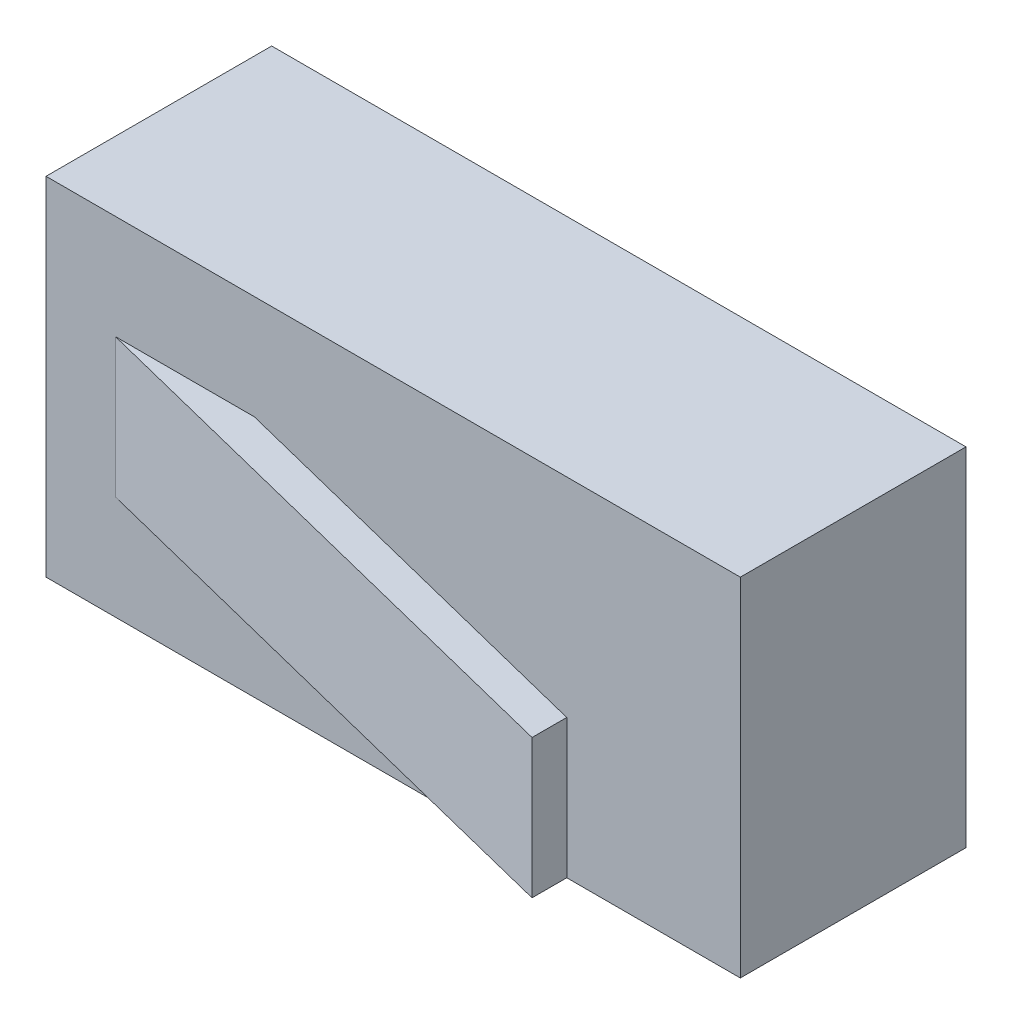
ISO-10303-21;
HEADER;
FILE_DESCRIPTION(('STEP AP214'),'2;1');
FILE_NAME('part.step','',(''),(''),'','','');
FILE_SCHEMA(('AUTOMOTIVE_DESIGN { 1 0 10303 214 1 1 1 1 }'));
ENDSEC;
DATA;
#1=APPLICATION_CONTEXT('core data for automotive mechanical design processes');
#2=APPLICATION_PROTOCOL_DEFINITION('international standard','automotive_design',2000,#1);
#3=PRODUCT_CONTEXT('',#1,'mechanical');
#4=PRODUCT('Part','Part','',(#3));
#5=PRODUCT_RELATED_PRODUCT_CATEGORY('part','',(#4));
#6=PRODUCT_DEFINITION_FORMATION('','',#4);
#7=PRODUCT_DEFINITION_CONTEXT('part definition',#1,'design');
#8=PRODUCT_DEFINITION('design','',#6,#7);
#9=PRODUCT_DEFINITION_SHAPE('','',#8);
#10=(LENGTH_UNIT() NAMED_UNIT(*) SI_UNIT(.MILLI.,.METRE.));
#11=(NAMED_UNIT(*) PLANE_ANGLE_UNIT() SI_UNIT($,.RADIAN.));
#12=(NAMED_UNIT(*) SI_UNIT($,.STERADIAN.) SOLID_ANGLE_UNIT());
#13=UNCERTAINTY_MEASURE_WITH_UNIT(LENGTH_MEASURE(1.E-05),#10,'distance_accuracy_value','');
#14=(GEOMETRIC_REPRESENTATION_CONTEXT(3) GLOBAL_UNCERTAINTY_ASSIGNED_CONTEXT((#13)) GLOBAL_UNIT_ASSIGNED_CONTEXT((#10,
#11,#12)) REPRESENTATION_CONTEXT('',''));
#15=CARTESIAN_POINT('',(0.,0.,0.));
#16=DIRECTION('',(0.,0.,1.));
#17=DIRECTION('',(1.,0.,0.));
#18=AXIS2_PLACEMENT_3D('',#15,#16,#17);
#19=CARTESIAN_POINT('',(-10.,9.,-215.));
#20=DIRECTION('',(-1.,0.,0.));
#21=DIRECTION('',(0.,0.,1.));
#22=AXIS2_PLACEMENT_3D('',#19,#20,#21);
#23=PLANE('',#22);
#24=DIRECTION('',(0.,-1.,0.));
#25=VECTOR('',#24,1.);
#26=CARTESIAN_POINT('',(-10.,9.,-208.5));
#27=LINE('',#26,#25);
#28=CARTESIAN_POINT('',(-10.,19.,-208.5));
#29=VERTEX_POINT('',#28);
#30=CARTESIAN_POINT('',(-10.,9.,-208.5));
#31=VERTEX_POINT('',#30);
#32=EDGE_CURVE('E131',#29,#31,#27,.T.);
#33=ORIENTED_EDGE('',*,*,#32,.F.);
#34=DIRECTION('',(0.,0.,1.));
#35=VECTOR('',#34,1.);
#36=CARTESIAN_POINT('',(-10.,19.,-215.));
#37=LINE('',#36,#35);
#38=CARTESIAN_POINT('',(-10.,19.,-215.));
#39=VERTEX_POINT('',#38);
#40=EDGE_CURVE('E156',#39,#29,#37,.T.);
#41=ORIENTED_EDGE('',*,*,#40,.F.);
#42=DIRECTION('',(0.,-1.,0.));
#43=VECTOR('',#42,1.);
#44=CARTESIAN_POINT('',(-10.,9.,-215.));
#45=LINE('',#44,#43);
#46=CARTESIAN_POINT('',(-10.,9.,-215.));
#47=VERTEX_POINT('',#46);
#48=EDGE_CURVE('E132',#39,#47,#45,.T.);
#49=ORIENTED_EDGE('',*,*,#48,.T.);
#50=DIRECTION('',(0.,0.,1.));
#51=VECTOR('',#50,1.);
#52=CARTESIAN_POINT('',(-10.,9.,-215.));
#53=LINE('',#52,#51);
#54=EDGE_CURVE('E145',#47,#31,#53,.T.);
#55=ORIENTED_EDGE('',*,*,#54,.T.);
#56=EDGE_LOOP('',(#33,#41,#49,#55));
#57=FACE_BOUND('',#56,.T.);
#58=ADVANCED_FACE('F39',(#57),#23,.T.);
#59=CARTESIAN_POINT('',(-10.,19.,-215.));
#60=DIRECTION('',(0.,1.,0.));
#61=DIRECTION('',(0.,0.,1.));
#62=AXIS2_PLACEMENT_3D('',#59,#60,#61);
#63=PLANE('',#62);
#64=DIRECTION('',(-1.,0.,0.));
#65=VECTOR('',#64,1.);
#66=CARTESIAN_POINT('',(-10.,19.,-208.5));
#67=LINE('',#66,#65);
#68=CARTESIAN_POINT('',(10.,19.,-208.5));
#69=VERTEX_POINT('',#68);
#70=EDGE_CURVE('E136',#69,#29,#67,.T.);
#71=ORIENTED_EDGE('',*,*,#70,.F.);
#72=DIRECTION('',(0.,0.,1.));
#73=VECTOR('',#72,1.);
#74=CARTESIAN_POINT('',(10.,19.,-215.));
#75=LINE('',#74,#73);
#76=CARTESIAN_POINT('',(10.,19.,-215.));
#77=VERTEX_POINT('',#76);
#78=EDGE_CURVE('E159',#77,#69,#75,.T.);
#79=ORIENTED_EDGE('',*,*,#78,.F.);
#80=DIRECTION('',(-1.,0.,0.));
#81=VECTOR('',#80,1.);
#82=CARTESIAN_POINT('',(-10.,19.,-215.));
#83=LINE('',#82,#81);
#84=EDGE_CURVE('E142',#77,#39,#83,.T.);
#85=ORIENTED_EDGE('',*,*,#84,.T.);
#86=ORIENTED_EDGE('',*,*,#40,.T.);
#87=EDGE_LOOP('',(#71,#79,#85,#86));
#88=FACE_BOUND('',#87,.T.);
#89=ADVANCED_FACE('F182',(#88),#63,.T.);
#90=CARTESIAN_POINT('',(10.,9.,-215.));
#91=DIRECTION('',(1.,0.,0.));
#92=DIRECTION('',(0.,0.,-1.));
#93=AXIS2_PLACEMENT_3D('',#90,#91,#92);
#94=PLANE('',#93);
#95=DIRECTION('',(0.,1.,0.));
#96=VECTOR('',#95,1.);
#97=CARTESIAN_POINT('',(10.,9.,-208.5));
#98=LINE('',#97,#96);
#99=CARTESIAN_POINT('',(10.,9.,-208.5));
#100=VERTEX_POINT('',#99);
#101=EDGE_CURVE('E151',#100,#69,#98,.T.);
#102=ORIENTED_EDGE('',*,*,#101,.F.);
#103=DIRECTION('',(0.,0.,1.));
#104=VECTOR('',#103,1.);
#105=CARTESIAN_POINT('',(10.,9.,-215.));
#106=LINE('',#105,#104);
#107=CARTESIAN_POINT('',(10.,9.,-215.));
#108=VERTEX_POINT('',#107);
#109=EDGE_CURVE('E161',#108,#100,#106,.T.);
#110=ORIENTED_EDGE('',*,*,#109,.F.);
#111=DIRECTION('',(0.,1.,0.));
#112=VECTOR('',#111,1.);
#113=CARTESIAN_POINT('',(10.,9.,-215.));
#114=LINE('',#113,#112);
#115=EDGE_CURVE('E139',#108,#77,#114,.T.);
#116=ORIENTED_EDGE('',*,*,#115,.T.);
#117=ORIENTED_EDGE('',*,*,#78,.T.);
#118=EDGE_LOOP('',(#102,#110,#116,#117));
#119=FACE_BOUND('',#118,.T.);
#120=ADVANCED_FACE('F187',(#119),#94,.T.);
#121=CARTESIAN_POINT('',(-10.,9.,-215.));
#122=DIRECTION('',(0.,-1.,0.));
#123=DIRECTION('',(0.,0.,-1.));
#124=AXIS2_PLACEMENT_3D('',#121,#122,#123);
#125=PLANE('',#124);
#126=DIRECTION('',(1.,0.,0.));
#127=VECTOR('',#126,1.);
#128=CARTESIAN_POINT('',(-10.,9.,-208.5));
#129=LINE('',#128,#127);
#130=EDGE_CURVE('E148',#31,#100,#129,.T.);
#131=ORIENTED_EDGE('',*,*,#130,.F.);
#132=ORIENTED_EDGE('',*,*,#54,.F.);
#133=DIRECTION('',(1.,0.,0.));
#134=VECTOR('',#133,1.);
#135=CARTESIAN_POINT('',(-10.,9.,-215.));
#136=LINE('',#135,#134);
#137=EDGE_CURVE('E135',#47,#108,#136,.T.);
#138=ORIENTED_EDGE('',*,*,#137,.T.);
#139=ORIENTED_EDGE('',*,*,#109,.T.);
#140=EDGE_LOOP('',(#131,#132,#138,#139));
#141=FACE_BOUND('',#140,.T.);
#142=ADVANCED_FACE('F201',(#141),#125,.T.);
#143=CARTESIAN_POINT('',(0.,0.,-215.));
#144=DIRECTION('',(0.,0.,-1.));
#145=DIRECTION('',(-1.,0.,0.));
#146=AXIS2_PLACEMENT_3D('',#143,#144,#145);
#147=PLANE('',#146);
#148=ORIENTED_EDGE('',*,*,#48,.F.);
#149=ORIENTED_EDGE('',*,*,#84,.F.);
#150=ORIENTED_EDGE('',*,*,#115,.F.);
#151=ORIENTED_EDGE('',*,*,#137,.F.);
#152=EDGE_LOOP('',(#148,#149,#150,#151));
#153=FACE_BOUND('',#152,.T.);
#154=ADVANCED_FACE('F198',(#153),#147,.T.);
#155=CARTESIAN_POINT('',(0.,0.,-208.5));
#156=DIRECTION('',(0.,0.,-1.));
#157=DIRECTION('',(-1.,0.,0.));
#158=AXIS2_PLACEMENT_3D('',#155,#156,#157);
#159=PLANE('',#158);
#160=DIRECTION('',(0.,-1.,0.));
#161=VECTOR('',#160,1.);
#162=CARTESIAN_POINT('',(-8.,16.,-208.5));
#163=LINE('',#162,#161);
#164=CARTESIAN_POINT('',(-8.,16.,-208.5));
#165=VERTEX_POINT('',#164);
#166=CARTESIAN_POINT('',(-8.,12.,-208.5));
#167=VERTEX_POINT('',#166);
#168=EDGE_CURVE('E52',#165,#167,#163,.T.);
#169=ORIENTED_EDGE('',*,*,#168,.F.);
#170=DIRECTION('',(1.,0.,0.));
#171=VECTOR('',#170,1.);
#172=CARTESIAN_POINT('',(0.,16.,-208.5));
#173=LINE('',#172,#171);
#174=CARTESIAN_POINT('',(-4.,16.,-208.5));
#175=VERTEX_POINT('',#174);
#176=EDGE_CURVE('E11',#165,#175,#173,.T.);
#177=ORIENTED_EDGE('',*,*,#176,.T.);
#178=DIRECTION('',(0.,1.,0.));
#179=VECTOR('',#178,1.);
#180=CARTESIAN_POINT('',(-4.,0.,-208.5));
#181=LINE('',#180,#179);
#182=CARTESIAN_POINT('',(-3.99999999999999,12.,-208.5));
#183=VERTEX_POINT('',#182);
#184=EDGE_CURVE('E46',#183,#175,#181,.T.);
#185=ORIENTED_EDGE('',*,*,#184,.F.);
#186=DIRECTION('',(1.,0.,0.));
#187=VECTOR('',#186,1.);
#188=CARTESIAN_POINT('',(0.,12.,-208.5));
#189=LINE('',#188,#187);
#190=EDGE_CURVE('E158',#167,#183,#189,.T.);
#191=ORIENTED_EDGE('',*,*,#190,.F.);
#192=EDGE_LOOP('',(#169,#177,#185,#191));
#193=FACE_BOUND('',#192,.T.);
#194=ORIENTED_EDGE('',*,*,#32,.T.);
#195=ORIENTED_EDGE('',*,*,#130,.T.);
#196=ORIENTED_EDGE('',*,*,#101,.T.);
#197=ORIENTED_EDGE('',*,*,#70,.T.);
#198=EDGE_LOOP('',(#194,#195,#196,#197));
#199=FACE_BOUND('',#198,.T.);
#200=ADVANCED_FACE('F168',(#193,#199),#159,.F.);
#201=CARTESIAN_POINT('',(8.,16.,-205.5));
#202=DIRECTION('',(-0.242535625036333,0.,0.970142500145332));
#203=DIRECTION('',(0.970142500145332,0.,0.242535625036333));
#204=AXIS2_PLACEMENT_3D('',#201,#202,#203);
#205=PLANE('',#204);
#206=DIRECTION('',(-0.970142500145332,0.,-0.242535625036333));
#207=VECTOR('',#206,1.);
#208=CARTESIAN_POINT('',(8.,12.,-205.5));
#209=LINE('',#208,#207);
#210=CARTESIAN_POINT('',(8.,12.,-205.5));
#211=VERTEX_POINT('',#210);
#212=EDGE_CURVE('E106',#211,#183,#209,.T.);
#213=ORIENTED_EDGE('',*,*,#212,.T.);
#214=ORIENTED_EDGE('',*,*,#184,.T.);
#215=DIRECTION('',(-0.970142500145332,0.,-0.242535625036333));
#216=VECTOR('',#215,1.);
#217=CARTESIAN_POINT('',(8.,16.,-205.5));
#218=LINE('',#217,#216);
#219=CARTESIAN_POINT('',(8.,16.,-205.5));
#220=VERTEX_POINT('',#219);
#221=EDGE_CURVE('E120',#220,#175,#218,.T.);
#222=ORIENTED_EDGE('',*,*,#221,.F.);
#223=DIRECTION('',(0.,-1.,0.));
#224=VECTOR('',#223,1.);
#225=CARTESIAN_POINT('',(8.,16.,-205.5));
#226=LINE('',#225,#224);
#227=EDGE_CURVE('E115',#220,#211,#226,.T.);
#228=ORIENTED_EDGE('',*,*,#227,.T.);
#229=EDGE_LOOP('',(#213,#214,#222,#228));
#230=FACE_BOUND('',#229,.T.);
#231=ADVANCED_FACE('F166',(#230),#205,.F.);
#232=CARTESIAN_POINT('',(0.,16.,0.));
#233=DIRECTION('',(0.,1.,0.));
#234=DIRECTION('',(0.,0.,1.));
#235=AXIS2_PLACEMENT_3D('',#232,#233,#234);
#236=PLANE('',#235);
#237=ORIENTED_EDGE('',*,*,#176,.F.);
#238=DIRECTION('',(0.970142500145332,0.,0.242535625036333));
#239=VECTOR('',#238,1.);
#240=CARTESIAN_POINT('',(-8.,16.,-208.5));
#241=LINE('',#240,#239);
#242=CARTESIAN_POINT('',(8.,16.,-204.5));
#243=VERTEX_POINT('',#242);
#244=EDGE_CURVE('E98',#165,#243,#241,.T.);
#245=ORIENTED_EDGE('',*,*,#244,.T.);
#246=DIRECTION('',(0.,0.,-1.));
#247=VECTOR('',#246,1.);
#248=CARTESIAN_POINT('',(8.,16.,-204.5));
#249=LINE('',#248,#247);
#250=EDGE_CURVE('E103',#243,#220,#249,.T.);
#251=ORIENTED_EDGE('',*,*,#250,.T.);
#252=ORIENTED_EDGE('',*,*,#221,.T.);
#253=EDGE_LOOP('',(#237,#245,#251,#252));
#254=FACE_BOUND('',#253,.T.);
#255=ADVANCED_FACE('F100',(#254),#236,.T.);
#256=CARTESIAN_POINT('',(0.,12.,0.));
#257=DIRECTION('',(0.,1.,0.));
#258=DIRECTION('',(0.,0.,1.));
#259=AXIS2_PLACEMENT_3D('',#256,#257,#258);
#260=PLANE('',#259);
#261=DIRECTION('',(0.970142500145332,0.,0.242535625036333));
#262=VECTOR('',#261,1.);
#263=CARTESIAN_POINT('',(-8.,12.,-208.5));
#264=LINE('',#263,#262);
#265=CARTESIAN_POINT('',(8.,12.,-204.5));
#266=VERTEX_POINT('',#265);
#267=EDGE_CURVE('E112',#167,#266,#264,.T.);
#268=ORIENTED_EDGE('',*,*,#267,.F.);
#269=ORIENTED_EDGE('',*,*,#190,.T.);
#270=ORIENTED_EDGE('',*,*,#212,.F.);
#271=DIRECTION('',(0.,0.,-1.));
#272=VECTOR('',#271,1.);
#273=CARTESIAN_POINT('',(8.,12.,-204.5));
#274=LINE('',#273,#272);
#275=EDGE_CURVE('E125',#266,#211,#274,.T.);
#276=ORIENTED_EDGE('',*,*,#275,.F.);
#277=EDGE_LOOP('',(#268,#269,#270,#276));
#278=FACE_BOUND('',#277,.T.);
#279=ADVANCED_FACE('F171',(#278),#260,.F.);
#280=CARTESIAN_POINT('',(-8.,16.,-208.5));
#281=DIRECTION('',(0.242535625036333,0.,-0.970142500145332));
#282=DIRECTION('',(-0.970142500145332,0.,-0.242535625036333));
#283=AXIS2_PLACEMENT_3D('',#280,#281,#282);
#284=PLANE('',#283);
#285=ORIENTED_EDGE('',*,*,#267,.T.);
#286=DIRECTION('',(0.,-1.,0.));
#287=VECTOR('',#286,1.);
#288=CARTESIAN_POINT('',(8.,16.,-204.5));
#289=LINE('',#288,#287);
#290=EDGE_CURVE('E109',#243,#266,#289,.T.);
#291=ORIENTED_EDGE('',*,*,#290,.F.);
#292=ORIENTED_EDGE('',*,*,#244,.F.);
#293=ORIENTED_EDGE('',*,*,#168,.T.);
#294=EDGE_LOOP('',(#285,#291,#292,#293));
#295=FACE_BOUND('',#294,.T.);
#296=ADVANCED_FACE('F110',(#295),#284,.F.);
#297=CARTESIAN_POINT('',(8.,16.,-204.5));
#298=DIRECTION('',(-1.,0.,0.));
#299=DIRECTION('',(0.,0.,1.));
#300=AXIS2_PLACEMENT_3D('',#297,#298,#299);
#301=PLANE('',#300);
#302=ORIENTED_EDGE('',*,*,#275,.T.);
#303=ORIENTED_EDGE('',*,*,#227,.F.);
#304=ORIENTED_EDGE('',*,*,#250,.F.);
#305=ORIENTED_EDGE('',*,*,#290,.T.);
#306=EDGE_LOOP('',(#302,#303,#304,#305));
#307=FACE_BOUND('',#306,.T.);
#308=ADVANCED_FACE('F117',(#307),#301,.F.);
#309=CLOSED_SHELL('',(#58,#89,#120,#142,#154,#200,#231,#255,#279,#296,#308));
#310=MANIFOLD_SOLID_BREP('B2',#309);
#311=ADVANCED_BREP_SHAPE_REPRESENTATION('',(#18,#310),#14);
#312=SHAPE_DEFINITION_REPRESENTATION(#9,#311);
ENDSEC;
END-ISO-10303-21;
